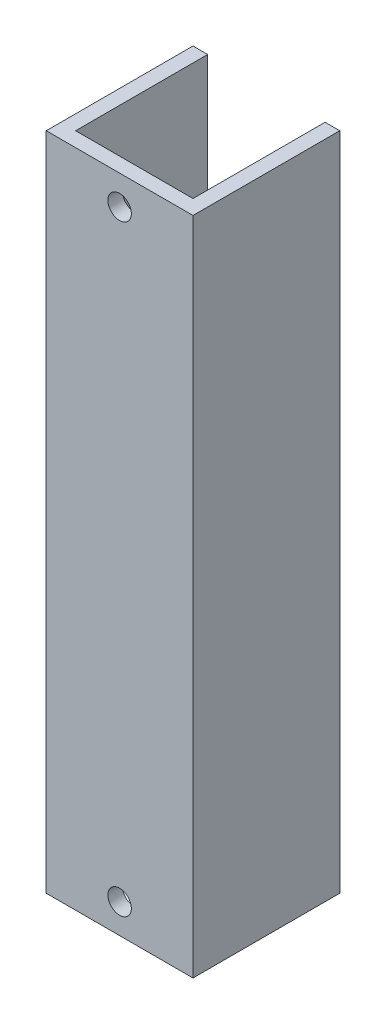
ISO-10303-21;
HEADER;
FILE_DESCRIPTION(('STEP AP214'),'2;1');
FILE_NAME('part.step','',(''),(''),'','','');
FILE_SCHEMA(('AUTOMOTIVE_DESIGN { 1 0 10303 214 1 1 1 1 }'));
ENDSEC;
DATA;
#1=APPLICATION_CONTEXT('core data for automotive mechanical design processes');
#2=APPLICATION_PROTOCOL_DEFINITION('international standard','automotive_design',2000,#1);
#3=PRODUCT_CONTEXT('',#1,'mechanical');
#4=PRODUCT('Part','Part','',(#3));
#5=PRODUCT_RELATED_PRODUCT_CATEGORY('part','',(#4));
#6=PRODUCT_DEFINITION_FORMATION('','',#4);
#7=PRODUCT_DEFINITION_CONTEXT('part definition',#1,'design');
#8=PRODUCT_DEFINITION('design','',#6,#7);
#9=PRODUCT_DEFINITION_SHAPE('','',#8);
#10=(LENGTH_UNIT() NAMED_UNIT(*) SI_UNIT(.MILLI.,.METRE.));
#11=(NAMED_UNIT(*) PLANE_ANGLE_UNIT() SI_UNIT($,.RADIAN.));
#12=(NAMED_UNIT(*) SI_UNIT($,.STERADIAN.) SOLID_ANGLE_UNIT());
#13=UNCERTAINTY_MEASURE_WITH_UNIT(LENGTH_MEASURE(1.E-05),#10,'distance_accuracy_value','');
#14=(GEOMETRIC_REPRESENTATION_CONTEXT(3) GLOBAL_UNCERTAINTY_ASSIGNED_CONTEXT((#13)) GLOBAL_UNIT_ASSIGNED_CONTEXT((#10,
#11,#12)) REPRESENTATION_CONTEXT('',''));
#15=CARTESIAN_POINT('',(0.,0.,0.));
#16=DIRECTION('',(0.,0.,1.));
#17=DIRECTION('',(1.,0.,0.));
#18=AXIS2_PLACEMENT_3D('',#15,#16,#17);
#19=CARTESIAN_POINT('',(0.,142.875,0.));
#20=DIRECTION('',(1.,0.,0.));
#21=DIRECTION('',(0.,0.,-1.));
#22=AXIS2_PLACEMENT_3D('',#19,#20,#21);
#23=PLANE('',#22);
#24=DIRECTION('',(0.,0.,1.));
#25=VECTOR('',#24,1.);
#26=CARTESIAN_POINT('',(0.,0.,0.));
#27=LINE('',#26,#25);
#28=CARTESIAN_POINT('',(0.,0.,-31.75));
#29=VERTEX_POINT('',#28);
#30=CARTESIAN_POINT('',(0.,0.,0.));
#31=VERTEX_POINT('',#30);
#32=EDGE_CURVE('E129',#29,#31,#27,.T.);
#33=ORIENTED_EDGE('',*,*,#32,.T.);
#34=DIRECTION('',(0.,-1.,0.));
#35=VECTOR('',#34,1.);
#36=CARTESIAN_POINT('',(0.,142.875,0.));
#37=LINE('',#36,#35);
#38=CARTESIAN_POINT('',(0.,142.875,0.));
#39=VERTEX_POINT('',#38);
#40=EDGE_CURVE('E11',#39,#31,#37,.T.);
#41=ORIENTED_EDGE('',*,*,#40,.F.);
#42=DIRECTION('',(0.,0.,1.));
#43=VECTOR('',#42,1.);
#44=CARTESIAN_POINT('',(0.,142.875,0.));
#45=LINE('',#44,#43);
#46=CARTESIAN_POINT('',(0.,142.875,-31.75));
#47=VERTEX_POINT('',#46);
#48=EDGE_CURVE('E144',#47,#39,#45,.T.);
#49=ORIENTED_EDGE('',*,*,#48,.F.);
#50=DIRECTION('',(0.,-1.,0.));
#51=VECTOR('',#50,1.);
#52=CARTESIAN_POINT('',(0.,142.875,-31.75));
#53=LINE('',#52,#51);
#54=EDGE_CURVE('E125',#47,#29,#53,.T.);
#55=ORIENTED_EDGE('',*,*,#54,.T.);
#56=EDGE_LOOP('',(#33,#41,#49,#55));
#57=FACE_BOUND('',#56,.T.);
#58=ADVANCED_FACE('F33',(#57),#23,.F.);
#59=CARTESIAN_POINT('',(0.,142.875,0.));
#60=DIRECTION('',(0.,0.,-1.));
#61=DIRECTION('',(-1.,0.,0.));
#62=AXIS2_PLACEMENT_3D('',#59,#60,#61);
#63=PLANE('',#62);
#64=CARTESIAN_POINT('',(15.875,136.525,0.));
#65=DIRECTION('',(0.,0.,-1.));
#66=DIRECTION('',(-1.,0.,0.));
#67=AXIS2_PLACEMENT_3D('',#64,#65,#66);
#68=CIRCLE('',#67,2.54);
#69=CARTESIAN_POINT('',(13.335,136.525,0.));
#70=VERTEX_POINT('',#69);
#71=EDGE_CURVE('E180',#70,#70,#68,.T.);
#72=ORIENTED_EDGE('',*,*,#71,.T.);
#73=EDGE_LOOP('',(#72));
#74=FACE_BOUND('',#73,.T.);
#75=CARTESIAN_POINT('',(15.875,6.34999999999993,0.));
#76=DIRECTION('',(0.,0.,-1.));
#77=DIRECTION('',(-1.,0.,0.));
#78=AXIS2_PLACEMENT_3D('',#75,#76,#77);
#79=CIRCLE('',#78,2.54);
#80=CARTESIAN_POINT('',(13.335,6.34999999999993,0.));
#81=VERTEX_POINT('',#80);
#82=EDGE_CURVE('E133',#81,#81,#79,.T.);
#83=ORIENTED_EDGE('',*,*,#82,.T.);
#84=EDGE_LOOP('',(#83));
#85=FACE_BOUND('',#84,.T.);
#86=DIRECTION('',(1.,0.,0.));
#87=VECTOR('',#86,1.);
#88=CARTESIAN_POINT('',(0.,0.,0.));
#89=LINE('',#88,#87);
#90=CARTESIAN_POINT('',(31.75,0.,0.));
#91=VERTEX_POINT('',#90);
#92=EDGE_CURVE('E132',#31,#91,#89,.T.);
#93=ORIENTED_EDGE('',*,*,#92,.T.);
#94=DIRECTION('',(0.,-1.,0.));
#95=VECTOR('',#94,1.);
#96=CARTESIAN_POINT('',(31.75,142.875,0.));
#97=LINE('',#96,#95);
#98=CARTESIAN_POINT('',(31.75,142.875,0.));
#99=VERTEX_POINT('',#98);
#100=EDGE_CURVE('E41',#99,#91,#97,.T.);
#101=ORIENTED_EDGE('',*,*,#100,.F.);
#102=DIRECTION('',(1.,0.,0.));
#103=VECTOR('',#102,1.);
#104=CARTESIAN_POINT('',(0.,142.875,0.));
#105=LINE('',#104,#103);
#106=EDGE_CURVE('E92',#39,#99,#105,.T.);
#107=ORIENTED_EDGE('',*,*,#106,.F.);
#108=ORIENTED_EDGE('',*,*,#40,.T.);
#109=EDGE_LOOP('',(#93,#101,#107,#108));
#110=FACE_BOUND('',#109,.T.);
#111=ADVANCED_FACE('F189',(#74,#85,#110),#63,.F.);
#112=CARTESIAN_POINT('',(31.75,142.875,0.));
#113=DIRECTION('',(-1.,0.,0.));
#114=DIRECTION('',(0.,0.,1.));
#115=AXIS2_PLACEMENT_3D('',#112,#113,#114);
#116=PLANE('',#115);
#117=DIRECTION('',(0.,0.,-1.));
#118=VECTOR('',#117,1.);
#119=CARTESIAN_POINT('',(31.75,0.,0.));
#120=LINE('',#119,#118);
#121=CARTESIAN_POINT('',(31.75,0.,-31.75));
#122=VERTEX_POINT('',#121);
#123=EDGE_CURVE('E135',#91,#122,#120,.T.);
#124=ORIENTED_EDGE('',*,*,#123,.T.);
#125=DIRECTION('',(0.,-1.,0.));
#126=VECTOR('',#125,1.);
#127=CARTESIAN_POINT('',(31.75,142.875,-31.75));
#128=LINE('',#127,#126);
#129=CARTESIAN_POINT('',(31.75,142.875,-31.75));
#130=VERTEX_POINT('',#129);
#131=EDGE_CURVE('E151',#130,#122,#128,.T.);
#132=ORIENTED_EDGE('',*,*,#131,.F.);
#133=DIRECTION('',(0.,0.,-1.));
#134=VECTOR('',#133,1.);
#135=CARTESIAN_POINT('',(31.75,142.875,0.));
#136=LINE('',#135,#134);
#137=EDGE_CURVE('E159',#99,#130,#136,.T.);
#138=ORIENTED_EDGE('',*,*,#137,.F.);
#139=ORIENTED_EDGE('',*,*,#100,.T.);
#140=EDGE_LOOP('',(#124,#132,#138,#139));
#141=FACE_BOUND('',#140,.T.);
#142=ADVANCED_FACE('F157',(#141),#116,.F.);
#143=CARTESIAN_POINT('',(31.75,142.875,-31.75));
#144=DIRECTION('',(0.,0.,1.));
#145=DIRECTION('',(1.,0.,0.));
#146=AXIS2_PLACEMENT_3D('',#143,#144,#145);
#147=PLANE('',#146);
#148=DIRECTION('',(-1.,0.,0.));
#149=VECTOR('',#148,1.);
#150=CARTESIAN_POINT('',(31.75,0.,-31.75));
#151=LINE('',#150,#149);
#152=CARTESIAN_POINT('',(28.575,0.,-31.75));
#153=VERTEX_POINT('',#152);
#154=EDGE_CURVE('E137',#122,#153,#151,.T.);
#155=ORIENTED_EDGE('',*,*,#154,.T.);
#156=DIRECTION('',(0.,-1.,0.));
#157=VECTOR('',#156,1.);
#158=CARTESIAN_POINT('',(28.575,142.875,-31.75));
#159=LINE('',#158,#157);
#160=CARTESIAN_POINT('',(28.575,142.875,-31.75));
#161=VERTEX_POINT('',#160);
#162=EDGE_CURVE('E148',#161,#153,#159,.T.);
#163=ORIENTED_EDGE('',*,*,#162,.F.);
#164=DIRECTION('',(-1.,0.,0.));
#165=VECTOR('',#164,1.);
#166=CARTESIAN_POINT('',(31.75,142.875,-31.75));
#167=LINE('',#166,#165);
#168=EDGE_CURVE('E171',#130,#161,#167,.T.);
#169=ORIENTED_EDGE('',*,*,#168,.F.);
#170=ORIENTED_EDGE('',*,*,#131,.T.);
#171=EDGE_LOOP('',(#155,#163,#169,#170));
#172=FACE_BOUND('',#171,.T.);
#173=ADVANCED_FACE('F167',(#172),#147,.F.);
#174=CARTESIAN_POINT('',(28.575,142.875,-3.175));
#175=DIRECTION('',(1.,0.,0.));
#176=DIRECTION('',(0.,0.,-1.));
#177=AXIS2_PLACEMENT_3D('',#174,#175,#176);
#178=PLANE('',#177);
#179=DIRECTION('',(0.,0.,1.));
#180=VECTOR('',#179,1.);
#181=CARTESIAN_POINT('',(28.575,0.,-3.175));
#182=LINE('',#181,#180);
#183=CARTESIAN_POINT('',(28.575,0.,-3.175));
#184=VERTEX_POINT('',#183);
#185=EDGE_CURVE('E139',#153,#184,#182,.T.);
#186=ORIENTED_EDGE('',*,*,#185,.T.);
#187=DIRECTION('',(0.,-1.,0.));
#188=VECTOR('',#187,1.);
#189=CARTESIAN_POINT('',(28.575,142.875,-3.175));
#190=LINE('',#189,#188);
#191=CARTESIAN_POINT('',(28.575,142.875,-3.175));
#192=VERTEX_POINT('',#191);
#193=EDGE_CURVE('E120',#192,#184,#190,.T.);
#194=ORIENTED_EDGE('',*,*,#193,.F.);
#195=DIRECTION('',(0.,0.,1.));
#196=VECTOR('',#195,1.);
#197=CARTESIAN_POINT('',(28.575,142.875,-3.175));
#198=LINE('',#197,#196);
#199=EDGE_CURVE('E111',#161,#192,#198,.T.);
#200=ORIENTED_EDGE('',*,*,#199,.F.);
#201=ORIENTED_EDGE('',*,*,#162,.T.);
#202=EDGE_LOOP('',(#186,#194,#200,#201));
#203=FACE_BOUND('',#202,.T.);
#204=ADVANCED_FACE('F170',(#203),#178,.F.);
#205=CARTESIAN_POINT('',(3.175,142.875,-3.175));
#206=DIRECTION('',(0.,0.,1.));
#207=DIRECTION('',(1.,0.,0.));
#208=AXIS2_PLACEMENT_3D('',#205,#206,#207);
#209=PLANE('',#208);
#210=CARTESIAN_POINT('',(15.875,136.525,-3.175));
#211=DIRECTION('',(0.,0.,-1.));
#212=DIRECTION('',(-1.,0.,0.));
#213=AXIS2_PLACEMENT_3D('',#210,#211,#212);
#214=CIRCLE('',#213,2.54);
#215=CARTESIAN_POINT('',(13.335,136.525,-3.175));
#216=VERTEX_POINT('',#215);
#217=EDGE_CURVE('E183',#216,#216,#214,.T.);
#218=ORIENTED_EDGE('',*,*,#217,.F.);
#219=EDGE_LOOP('',(#218));
#220=FACE_BOUND('',#219,.T.);
#221=CARTESIAN_POINT('',(15.875,6.34999999999993,-3.175));
#222=DIRECTION('',(0.,0.,-1.));
#223=DIRECTION('',(-1.,0.,0.));
#224=AXIS2_PLACEMENT_3D('',#221,#222,#223);
#225=CIRCLE('',#224,2.54);
#226=CARTESIAN_POINT('',(13.335,6.34999999999993,-3.175));
#227=VERTEX_POINT('',#226);
#228=EDGE_CURVE('E177',#227,#227,#225,.T.);
#229=ORIENTED_EDGE('',*,*,#228,.F.);
#230=EDGE_LOOP('',(#229));
#231=FACE_BOUND('',#230,.T.);
#232=DIRECTION('',(-1.,0.,0.));
#233=VECTOR('',#232,1.);
#234=CARTESIAN_POINT('',(3.175,0.,-3.175));
#235=LINE('',#234,#233);
#236=CARTESIAN_POINT('',(3.175,0.,-3.175));
#237=VERTEX_POINT('',#236);
#238=EDGE_CURVE('E119',#184,#237,#235,.T.);
#239=ORIENTED_EDGE('',*,*,#238,.T.);
#240=DIRECTION('',(0.,-1.,0.));
#241=VECTOR('',#240,1.);
#242=CARTESIAN_POINT('',(3.175,142.875,-3.175));
#243=LINE('',#242,#241);
#244=CARTESIAN_POINT('',(3.175,142.875,-3.175));
#245=VERTEX_POINT('',#244);
#246=EDGE_CURVE('E116',#245,#237,#243,.T.);
#247=ORIENTED_EDGE('',*,*,#246,.F.);
#248=DIRECTION('',(-1.,0.,0.));
#249=VECTOR('',#248,1.);
#250=CARTESIAN_POINT('',(3.175,142.875,-3.175));
#251=LINE('',#250,#249);
#252=EDGE_CURVE('E105',#192,#245,#251,.T.);
#253=ORIENTED_EDGE('',*,*,#252,.F.);
#254=ORIENTED_EDGE('',*,*,#193,.T.);
#255=EDGE_LOOP('',(#239,#247,#253,#254));
#256=FACE_BOUND('',#255,.T.);
#257=ADVANCED_FACE('F117',(#220,#231,#256),#209,.F.);
#258=CARTESIAN_POINT('',(3.175,142.875,-31.75));
#259=DIRECTION('',(-1.,0.,0.));
#260=DIRECTION('',(0.,0.,1.));
#261=AXIS2_PLACEMENT_3D('',#258,#259,#260);
#262=PLANE('',#261);
#263=DIRECTION('',(0.,0.,-1.));
#264=VECTOR('',#263,1.);
#265=CARTESIAN_POINT('',(3.175,0.,-31.75));
#266=LINE('',#265,#264);
#267=CARTESIAN_POINT('',(3.175,0.,-31.75));
#268=VERTEX_POINT('',#267);
#269=EDGE_CURVE('E78',#237,#268,#266,.T.);
#270=ORIENTED_EDGE('',*,*,#269,.T.);
#271=DIRECTION('',(0.,-1.,0.));
#272=VECTOR('',#271,1.);
#273=CARTESIAN_POINT('',(3.175,142.875,-31.75));
#274=LINE('',#273,#272);
#275=CARTESIAN_POINT('',(3.175,142.875,-31.75));
#276=VERTEX_POINT('',#275);
#277=EDGE_CURVE('E121',#276,#268,#274,.T.);
#278=ORIENTED_EDGE('',*,*,#277,.F.);
#279=DIRECTION('',(0.,0.,-1.));
#280=VECTOR('',#279,1.);
#281=CARTESIAN_POINT('',(3.175,142.875,-31.75));
#282=LINE('',#281,#280);
#283=EDGE_CURVE('E109',#245,#276,#282,.T.);
#284=ORIENTED_EDGE('',*,*,#283,.F.);
#285=ORIENTED_EDGE('',*,*,#246,.T.);
#286=EDGE_LOOP('',(#270,#278,#284,#285));
#287=FACE_BOUND('',#286,.T.);
#288=ADVANCED_FACE('F123',(#287),#262,.F.);
#289=CARTESIAN_POINT('',(0.,142.875,-31.75));
#290=DIRECTION('',(0.,0.,1.));
#291=DIRECTION('',(1.,0.,0.));
#292=AXIS2_PLACEMENT_3D('',#289,#290,#291);
#293=PLANE('',#292);
#294=DIRECTION('',(-1.,0.,0.));
#295=VECTOR('',#294,1.);
#296=CARTESIAN_POINT('',(0.,0.,-31.75));
#297=LINE('',#296,#295);
#298=EDGE_CURVE('E84',#268,#29,#297,.T.);
#299=ORIENTED_EDGE('',*,*,#298,.T.);
#300=ORIENTED_EDGE('',*,*,#54,.F.);
#301=DIRECTION('',(-1.,0.,0.));
#302=VECTOR('',#301,1.);
#303=CARTESIAN_POINT('',(0.,142.875,-31.75));
#304=LINE('',#303,#302);
#305=EDGE_CURVE('E49',#276,#47,#304,.T.);
#306=ORIENTED_EDGE('',*,*,#305,.F.);
#307=ORIENTED_EDGE('',*,*,#277,.T.);
#308=EDGE_LOOP('',(#299,#300,#306,#307));
#309=FACE_BOUND('',#308,.T.);
#310=ADVANCED_FACE('F220',(#309),#293,.F.);
#311=CARTESIAN_POINT('',(0.,142.875,0.));
#312=DIRECTION('',(0.,-1.,0.));
#313=DIRECTION('',(0.,0.,-1.));
#314=AXIS2_PLACEMENT_3D('',#311,#312,#313);
#315=PLANE('',#314);
#316=ORIENTED_EDGE('',*,*,#48,.T.);
#317=ORIENTED_EDGE('',*,*,#106,.T.);
#318=ORIENTED_EDGE('',*,*,#137,.T.);
#319=ORIENTED_EDGE('',*,*,#168,.T.);
#320=ORIENTED_EDGE('',*,*,#199,.T.);
#321=ORIENTED_EDGE('',*,*,#252,.T.);
#322=ORIENTED_EDGE('',*,*,#283,.T.);
#323=ORIENTED_EDGE('',*,*,#305,.T.);
#324=EDGE_LOOP('',(#316,#317,#318,#319,#320,#321,#322,#323));
#325=FACE_BOUND('',#324,.T.);
#326=ADVANCED_FACE('F107',(#325),#315,.F.);
#327=CARTESIAN_POINT('',(0.,0.,0.));
#328=DIRECTION('',(0.,-1.,0.));
#329=DIRECTION('',(0.,0.,-1.));
#330=AXIS2_PLACEMENT_3D('',#327,#328,#329);
#331=PLANE('',#330);
#332=ORIENTED_EDGE('',*,*,#32,.F.);
#333=ORIENTED_EDGE('',*,*,#298,.F.);
#334=ORIENTED_EDGE('',*,*,#269,.F.);
#335=ORIENTED_EDGE('',*,*,#238,.F.);
#336=ORIENTED_EDGE('',*,*,#185,.F.);
#337=ORIENTED_EDGE('',*,*,#154,.F.);
#338=ORIENTED_EDGE('',*,*,#123,.F.);
#339=ORIENTED_EDGE('',*,*,#92,.F.);
#340=EDGE_LOOP('',(#332,#333,#334,#335,#336,#337,#338,#339));
#341=FACE_BOUND('',#340,.T.);
#342=ADVANCED_FACE('F163',(#341),#331,.T.);
#343=CARTESIAN_POINT('',(15.875,6.34999999999993,0.));
#344=DIRECTION('',(0.,0.,-1.));
#345=DIRECTION('',(-1.,0.,0.));
#346=AXIS2_PLACEMENT_3D('',#343,#344,#345);
#347=CYLINDRICAL_SURFACE('',#346,2.54);
#348=ORIENTED_EDGE('',*,*,#82,.F.);
#349=EDGE_LOOP('',(#348));
#350=FACE_BOUND('',#349,.T.);
#351=ORIENTED_EDGE('',*,*,#228,.T.);
#352=EDGE_LOOP('',(#351));
#353=FACE_BOUND('',#352,.T.);
#354=ADVANCED_FACE('F195',(#350,#353),#347,.F.);
#355=CARTESIAN_POINT('',(15.875,136.525,0.));
#356=DIRECTION('',(0.,0.,-1.));
#357=DIRECTION('',(-1.,0.,0.));
#358=AXIS2_PLACEMENT_3D('',#355,#356,#357);
#359=CYLINDRICAL_SURFACE('',#358,2.54);
#360=ORIENTED_EDGE('',*,*,#71,.F.);
#361=EDGE_LOOP('',(#360));
#362=FACE_BOUND('',#361,.T.);
#363=ORIENTED_EDGE('',*,*,#217,.T.);
#364=EDGE_LOOP('',(#363));
#365=FACE_BOUND('',#364,.T.);
#366=ADVANCED_FACE('F192',(#362,#365),#359,.F.);
#367=CLOSED_SHELL('',(#58,#111,#142,#173,#204,#257,#288,#310,#326,#342,#354,#366));
#368=MANIFOLD_SOLID_BREP('B2',#367);
#369=ADVANCED_BREP_SHAPE_REPRESENTATION('',(#18,#368),#14);
#370=SHAPE_DEFINITION_REPRESENTATION(#9,#369);
ENDSEC;
END-ISO-10303-21;
